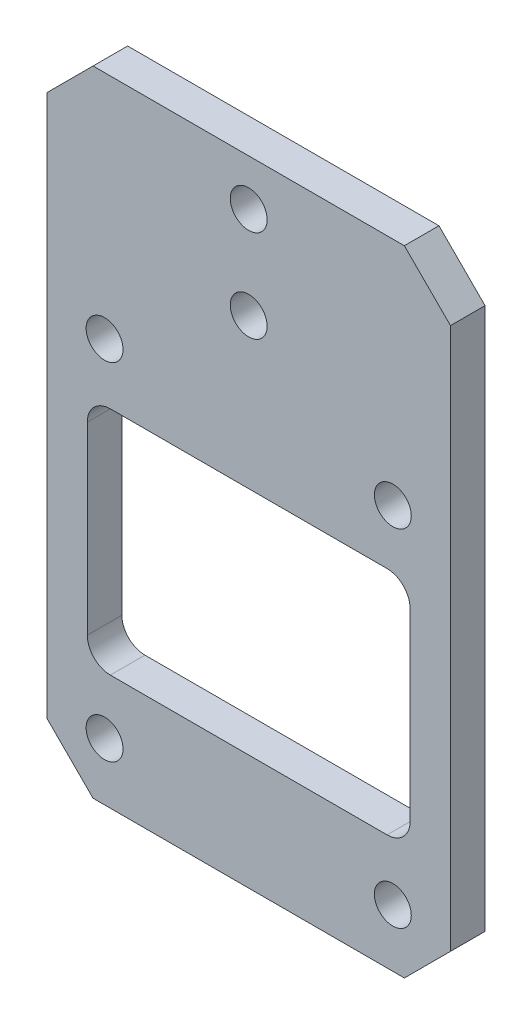
ISO-10303-21;
HEADER;
FILE_DESCRIPTION(('STEP AP214'),'2;1');
FILE_NAME('part.step','',(''),(''),'','','');
FILE_SCHEMA(('AUTOMOTIVE_DESIGN { 1 0 10303 214 1 1 1 1 }'));
ENDSEC;
DATA;
#1=APPLICATION_CONTEXT('core data for automotive mechanical design processes');
#2=APPLICATION_PROTOCOL_DEFINITION('international standard','automotive_design',2000,#1);
#3=PRODUCT_CONTEXT('',#1,'mechanical');
#4=PRODUCT('Part','Part','',(#3));
#5=PRODUCT_RELATED_PRODUCT_CATEGORY('part','',(#4));
#6=PRODUCT_DEFINITION_FORMATION('','',#4);
#7=PRODUCT_DEFINITION_CONTEXT('part definition',#1,'design');
#8=PRODUCT_DEFINITION('design','',#6,#7);
#9=PRODUCT_DEFINITION_SHAPE('','',#8);
#10=(LENGTH_UNIT() NAMED_UNIT(*) SI_UNIT(.MILLI.,.METRE.));
#11=(NAMED_UNIT(*) PLANE_ANGLE_UNIT() SI_UNIT($,.RADIAN.));
#12=(NAMED_UNIT(*) SI_UNIT($,.STERADIAN.) SOLID_ANGLE_UNIT());
#13=UNCERTAINTY_MEASURE_WITH_UNIT(LENGTH_MEASURE(1.E-05),#10,'distance_accuracy_value','');
#14=(GEOMETRIC_REPRESENTATION_CONTEXT(3) GLOBAL_UNCERTAINTY_ASSIGNED_CONTEXT((#13)) GLOBAL_UNIT_ASSIGNED_CONTEXT((#10,
#11,#12)) REPRESENTATION_CONTEXT('',''));
#15=CARTESIAN_POINT('',(0.,0.,0.));
#16=DIRECTION('',(0.,0.,1.));
#17=DIRECTION('',(1.,0.,0.));
#18=AXIS2_PLACEMENT_3D('',#15,#16,#17);
#19=CARTESIAN_POINT('',(-17.5,-27.5,3.));
#20=DIRECTION('',(1.,0.,0.));
#21=DIRECTION('',(0.,0.,-1.));
#22=AXIS2_PLACEMENT_3D('',#19,#20,#21);
#23=PLANE('',#22);
#24=DIRECTION('',(0.,-1.,0.));
#25=VECTOR('',#24,1.);
#26=CARTESIAN_POINT('',(-17.5,-27.5,0.));
#27=LINE('',#26,#25);
#28=CARTESIAN_POINT('',(-17.5,23.5,0.));
#29=VERTEX_POINT('',#28);
#30=CARTESIAN_POINT('',(-17.5,-23.5,0.));
#31=VERTEX_POINT('',#30);
#32=EDGE_CURVE('E179',#29,#31,#27,.T.);
#33=ORIENTED_EDGE('',*,*,#32,.T.);
#34=DIRECTION('',(0.,0.,1.));
#35=VECTOR('',#34,1.);
#36=CARTESIAN_POINT('',(-17.5,-23.5,3.));
#37=LINE('',#36,#35);
#38=CARTESIAN_POINT('',(-17.5,-23.5,3.));
#39=VERTEX_POINT('',#38);
#40=EDGE_CURVE('E157',#31,#39,#37,.T.);
#41=ORIENTED_EDGE('',*,*,#40,.T.);
#42=DIRECTION('',(0.,-1.,0.));
#43=VECTOR('',#42,1.);
#44=CARTESIAN_POINT('',(-17.5,-27.5,3.));
#45=LINE('',#44,#43);
#46=CARTESIAN_POINT('',(-17.5,23.5,3.));
#47=VERTEX_POINT('',#46);
#48=EDGE_CURVE('E190',#47,#39,#45,.T.);
#49=ORIENTED_EDGE('',*,*,#48,.F.);
#50=DIRECTION('',(0.,0.,-1.));
#51=VECTOR('',#50,1.);
#52=CARTESIAN_POINT('',(-17.5,23.5,3.));
#53=LINE('',#52,#51);
#54=EDGE_CURVE('E162',#47,#29,#53,.T.);
#55=ORIENTED_EDGE('',*,*,#54,.T.);
#56=EDGE_LOOP('',(#33,#41,#49,#55));
#57=FACE_BOUND('',#56,.T.);
#58=ADVANCED_FACE('F39',(#57),#23,.F.);
#59=CARTESIAN_POINT('',(17.5,-27.5,3.));
#60=DIRECTION('',(0.,1.,0.));
#61=DIRECTION('',(-1.,0.,0.));
#62=AXIS2_PLACEMENT_3D('',#59,#60,#61);
#63=PLANE('',#62);
#64=DIRECTION('',(1.,0.,0.));
#65=VECTOR('',#64,1.);
#66=CARTESIAN_POINT('',(17.5,-27.5,3.));
#67=LINE('',#66,#65);
#68=CARTESIAN_POINT('',(-13.5,-27.5,3.));
#69=VERTEX_POINT('',#68);
#70=CARTESIAN_POINT('',(13.5,-27.5,3.));
#71=VERTEX_POINT('',#70);
#72=EDGE_CURVE('E172',#69,#71,#67,.T.);
#73=ORIENTED_EDGE('',*,*,#72,.F.);
#74=DIRECTION('',(0.,0.,-1.));
#75=VECTOR('',#74,1.);
#76=CARTESIAN_POINT('',(-13.5,-27.5,3.));
#77=LINE('',#76,#75);
#78=CARTESIAN_POINT('',(-13.5,-27.5,0.));
#79=VERTEX_POINT('',#78);
#80=EDGE_CURVE('E156',#69,#79,#77,.T.);
#81=ORIENTED_EDGE('',*,*,#80,.T.);
#82=DIRECTION('',(1.,0.,0.));
#83=VECTOR('',#82,1.);
#84=CARTESIAN_POINT('',(17.5,-27.5,0.));
#85=LINE('',#84,#83);
#86=CARTESIAN_POINT('',(13.5,-27.5,0.));
#87=VERTEX_POINT('',#86);
#88=EDGE_CURVE('E169',#79,#87,#85,.T.);
#89=ORIENTED_EDGE('',*,*,#88,.T.);
#90=DIRECTION('',(0.,0.,1.));
#91=VECTOR('',#90,1.);
#92=CARTESIAN_POINT('',(13.5,-27.5,3.));
#93=LINE('',#92,#91);
#94=EDGE_CURVE('E174',#87,#71,#93,.T.);
#95=ORIENTED_EDGE('',*,*,#94,.T.);
#96=EDGE_LOOP('',(#73,#81,#89,#95));
#97=FACE_BOUND('',#96,.T.);
#98=ADVANCED_FACE('F168',(#97),#63,.F.);
#99=CARTESIAN_POINT('',(17.5,-27.5,3.));
#100=DIRECTION('',(-1.,0.,0.));
#101=DIRECTION('',(0.,0.,1.));
#102=AXIS2_PLACEMENT_3D('',#99,#100,#101);
#103=PLANE('',#102);
#104=DIRECTION('',(0.,1.,0.));
#105=VECTOR('',#104,1.);
#106=CARTESIAN_POINT('',(17.5,-27.5,3.));
#107=LINE('',#106,#105);
#108=CARTESIAN_POINT('',(17.5,-23.5,3.));
#109=VERTEX_POINT('',#108);
#110=CARTESIAN_POINT('',(17.5,23.5,3.));
#111=VERTEX_POINT('',#110);
#112=EDGE_CURVE('E322',#109,#111,#107,.T.);
#113=ORIENTED_EDGE('',*,*,#112,.F.);
#114=DIRECTION('',(0.,0.,-1.));
#115=VECTOR('',#114,1.);
#116=CARTESIAN_POINT('',(17.5,-23.5,3.));
#117=LINE('',#116,#115);
#118=CARTESIAN_POINT('',(17.5,-23.5,0.));
#119=VERTEX_POINT('',#118);
#120=EDGE_CURVE('E210',#109,#119,#117,.T.);
#121=ORIENTED_EDGE('',*,*,#120,.T.);
#122=DIRECTION('',(0.,1.,0.));
#123=VECTOR('',#122,1.);
#124=CARTESIAN_POINT('',(17.5,-27.5,0.));
#125=LINE('',#124,#123);
#126=CARTESIAN_POINT('',(17.5,23.5,0.));
#127=VERTEX_POINT('',#126);
#128=EDGE_CURVE('E178',#119,#127,#125,.T.);
#129=ORIENTED_EDGE('',*,*,#128,.T.);
#130=DIRECTION('',(0.,0.,1.));
#131=VECTOR('',#130,1.);
#132=CARTESIAN_POINT('',(17.5,23.5,3.));
#133=LINE('',#132,#131);
#134=EDGE_CURVE('E208',#127,#111,#133,.T.);
#135=ORIENTED_EDGE('',*,*,#134,.T.);
#136=EDGE_LOOP('',(#113,#121,#129,#135));
#137=FACE_BOUND('',#136,.T.);
#138=ADVANCED_FACE('F344',(#137),#103,.F.);
#139=CARTESIAN_POINT('',(17.5,27.5,3.));
#140=DIRECTION('',(0.,-1.,0.));
#141=DIRECTION('',(1.,0.,0.));
#142=AXIS2_PLACEMENT_3D('',#139,#140,#141);
#143=PLANE('',#142);
#144=DIRECTION('',(-1.,0.,0.));
#145=VECTOR('',#144,1.);
#146=CARTESIAN_POINT('',(17.5,27.5,3.));
#147=LINE('',#146,#145);
#148=CARTESIAN_POINT('',(13.5,27.5,3.));
#149=VERTEX_POINT('',#148);
#150=CARTESIAN_POINT('',(-13.5,27.5,3.));
#151=VERTEX_POINT('',#150);
#152=EDGE_CURVE('E191',#149,#151,#147,.T.);
#153=ORIENTED_EDGE('',*,*,#152,.F.);
#154=DIRECTION('',(0.,0.,-1.));
#155=VECTOR('',#154,1.);
#156=CARTESIAN_POINT('',(13.5,27.5,3.));
#157=LINE('',#156,#155);
#158=CARTESIAN_POINT('',(13.5,27.5,0.));
#159=VERTEX_POINT('',#158);
#160=EDGE_CURVE('E215',#149,#159,#157,.T.);
#161=ORIENTED_EDGE('',*,*,#160,.T.);
#162=DIRECTION('',(-1.,0.,0.));
#163=VECTOR('',#162,1.);
#164=CARTESIAN_POINT('',(17.5,27.5,0.));
#165=LINE('',#164,#163);
#166=CARTESIAN_POINT('',(-13.5,27.5,0.));
#167=VERTEX_POINT('',#166);
#168=EDGE_CURVE('E182',#159,#167,#165,.T.);
#169=ORIENTED_EDGE('',*,*,#168,.T.);
#170=DIRECTION('',(0.,0.,1.));
#171=VECTOR('',#170,1.);
#172=CARTESIAN_POINT('',(-13.5,27.5,3.));
#173=LINE('',#172,#171);
#174=EDGE_CURVE('E213',#167,#151,#173,.T.);
#175=ORIENTED_EDGE('',*,*,#174,.T.);
#176=EDGE_LOOP('',(#153,#161,#169,#175));
#177=FACE_BOUND('',#176,.T.);
#178=ADVANCED_FACE('F338',(#177),#143,.F.);
#179=CARTESIAN_POINT('',(0.,0.,3.));
#180=DIRECTION('',(0.,0.,1.));
#181=DIRECTION('',(1.,0.,0.));
#182=AXIS2_PLACEMENT_3D('',#179,#180,#181);
#183=PLANE('',#182);
#184=DIRECTION('',(0.,-1.,0.));
#185=VECTOR('',#184,1.);
#186=CARTESIAN_POINT('',(-14.,-17.5,3.));
#187=LINE('',#186,#185);
#188=CARTESIAN_POINT('',(-14.,0.499999999999997,3.));
#189=VERTEX_POINT('',#188);
#190=CARTESIAN_POINT('',(-14.,-15.5,3.));
#191=VERTEX_POINT('',#190);
#192=EDGE_CURVE('E255',#189,#191,#187,.T.);
#193=ORIENTED_EDGE('',*,*,#192,.F.);
#194=CARTESIAN_POINT('',(-12.,0.499999999999997,3.));
#195=DIRECTION('',(0.,0.,1.));
#196=DIRECTION('',(1.,0.,0.));
#197=AXIS2_PLACEMENT_3D('',#194,#195,#196);
#198=CIRCLE('',#197,2.);
#199=CARTESIAN_POINT('',(-12.,2.5,3.));
#200=VERTEX_POINT('',#199);
#201=EDGE_CURVE('E47',#189,#200,#198,.F.);
#202=ORIENTED_EDGE('',*,*,#201,.T.);
#203=DIRECTION('',(-1.,0.,0.));
#204=VECTOR('',#203,1.);
#205=CARTESIAN_POINT('',(14.,2.5,3.));
#206=LINE('',#205,#204);
#207=CARTESIAN_POINT('',(12.,2.5,3.));
#208=VERTEX_POINT('',#207);
#209=EDGE_CURVE('E254',#208,#200,#206,.T.);
#210=ORIENTED_EDGE('',*,*,#209,.F.);
#211=CARTESIAN_POINT('',(12.,0.5,3.));
#212=DIRECTION('',(0.,0.,1.));
#213=DIRECTION('',(1.,0.,0.));
#214=AXIS2_PLACEMENT_3D('',#211,#212,#213);
#215=CIRCLE('',#214,2.);
#216=CARTESIAN_POINT('',(14.,0.5,3.));
#217=VERTEX_POINT('',#216);
#218=EDGE_CURVE('E237',#208,#217,#215,.F.);
#219=ORIENTED_EDGE('',*,*,#218,.T.);
#220=DIRECTION('',(0.,1.,0.));
#221=VECTOR('',#220,1.);
#222=CARTESIAN_POINT('',(14.,-17.5,3.));
#223=LINE('',#222,#221);
#224=CARTESIAN_POINT('',(14.,-15.5,3.));
#225=VERTEX_POINT('',#224);
#226=EDGE_CURVE('E264',#225,#217,#223,.T.);
#227=ORIENTED_EDGE('',*,*,#226,.F.);
#228=CARTESIAN_POINT('',(12.,-15.5,3.));
#229=DIRECTION('',(0.,0.,1.));
#230=DIRECTION('',(1.,0.,0.));
#231=AXIS2_PLACEMENT_3D('',#228,#229,#230);
#232=CIRCLE('',#231,2.);
#233=CARTESIAN_POINT('',(12.,-17.5,3.));
#234=VERTEX_POINT('',#233);
#235=EDGE_CURVE('E241',#225,#234,#232,.F.);
#236=ORIENTED_EDGE('',*,*,#235,.T.);
#237=DIRECTION('',(1.,0.,0.));
#238=VECTOR('',#237,1.);
#239=CARTESIAN_POINT('',(14.,-17.5,3.));
#240=LINE('',#239,#238);
#241=CARTESIAN_POINT('',(-12.,-17.5,3.));
#242=VERTEX_POINT('',#241);
#243=EDGE_CURVE('E280',#242,#234,#240,.T.);
#244=ORIENTED_EDGE('',*,*,#243,.F.);
#245=CARTESIAN_POINT('',(-12.,-15.5,3.));
#246=DIRECTION('',(0.,0.,1.));
#247=DIRECTION('',(1.,0.,0.));
#248=AXIS2_PLACEMENT_3D('',#245,#246,#247);
#249=CIRCLE('',#248,2.);
#250=EDGE_CURVE('E245',#242,#191,#249,.F.);
#251=ORIENTED_EDGE('',*,*,#250,.T.);
#252=EDGE_LOOP('',(#193,#202,#210,#219,#227,#236,#244,#251));
#253=FACE_BOUND('',#252,.T.);
#254=CARTESIAN_POINT('',(0.,15.5,3.));
#255=DIRECTION('',(0.,0.,1.));
#256=DIRECTION('',(1.,0.,0.));
#257=AXIS2_PLACEMENT_3D('',#254,#255,#256);
#258=CIRCLE('',#257,1.6);
#259=CARTESIAN_POINT('',(1.6,15.5,3.));
#260=VERTEX_POINT('',#259);
#261=EDGE_CURVE('E278',#260,#260,#258,.T.);
#262=ORIENTED_EDGE('',*,*,#261,.F.);
#263=EDGE_LOOP('',(#262));
#264=FACE_BOUND('',#263,.T.);
#265=CARTESIAN_POINT('',(0.,23.5,3.));
#266=DIRECTION('',(0.,0.,1.));
#267=DIRECTION('',(1.,0.,0.));
#268=AXIS2_PLACEMENT_3D('',#265,#266,#267);
#269=CIRCLE('',#268,1.6);
#270=CARTESIAN_POINT('',(1.6,23.5,3.));
#271=VERTEX_POINT('',#270);
#272=EDGE_CURVE('E288',#271,#271,#269,.T.);
#273=ORIENTED_EDGE('',*,*,#272,.F.);
#274=EDGE_LOOP('',(#273));
#275=FACE_BOUND('',#274,.T.);
#276=CARTESIAN_POINT('',(-12.5,-22.5,3.));
#277=DIRECTION('',(0.,0.,1.));
#278=DIRECTION('',(1.,0.,0.));
#279=AXIS2_PLACEMENT_3D('',#276,#277,#278);
#280=CIRCLE('',#279,1.6);
#281=CARTESIAN_POINT('',(-10.9,-22.5,3.));
#282=VERTEX_POINT('',#281);
#283=EDGE_CURVE('E301',#282,#282,#280,.T.);
#284=ORIENTED_EDGE('',*,*,#283,.F.);
#285=EDGE_LOOP('',(#284));
#286=FACE_BOUND('',#285,.T.);
#287=CARTESIAN_POINT('',(12.5,7.5,3.));
#288=DIRECTION('',(0.,0.,1.));
#289=DIRECTION('',(1.,0.,0.));
#290=AXIS2_PLACEMENT_3D('',#287,#288,#289);
#291=CIRCLE('',#290,1.6);
#292=CARTESIAN_POINT('',(14.1,7.5,3.));
#293=VERTEX_POINT('',#292);
#294=EDGE_CURVE('E307',#293,#293,#291,.T.);
#295=ORIENTED_EDGE('',*,*,#294,.F.);
#296=EDGE_LOOP('',(#295));
#297=FACE_BOUND('',#296,.T.);
#298=CARTESIAN_POINT('',(12.5,-22.5,3.));
#299=DIRECTION('',(0.,0.,1.));
#300=DIRECTION('',(1.,0.,0.));
#301=AXIS2_PLACEMENT_3D('',#298,#299,#300);
#302=CIRCLE('',#301,1.6);
#303=CARTESIAN_POINT('',(14.1,-22.5,3.));
#304=VERTEX_POINT('',#303);
#305=EDGE_CURVE('E294',#304,#304,#302,.T.);
#306=ORIENTED_EDGE('',*,*,#305,.F.);
#307=EDGE_LOOP('',(#306));
#308=FACE_BOUND('',#307,.T.);
#309=CARTESIAN_POINT('',(-12.5,7.5,3.));
#310=DIRECTION('',(0.,0.,1.));
#311=DIRECTION('',(1.,0.,0.));
#312=AXIS2_PLACEMENT_3D('',#309,#310,#311);
#313=CIRCLE('',#312,1.6);
#314=CARTESIAN_POINT('',(-10.9,7.5,3.));
#315=VERTEX_POINT('',#314);
#316=EDGE_CURVE('E300',#315,#315,#313,.T.);
#317=ORIENTED_EDGE('',*,*,#316,.F.);
#318=EDGE_LOOP('',(#317));
#319=FACE_BOUND('',#318,.T.);
#320=ORIENTED_EDGE('',*,*,#48,.T.);
#321=DIRECTION('',(-0.707106781186546,0.707106781186549,0.));
#322=VECTOR('',#321,1.);
#323=CARTESIAN_POINT('',(-20.5,-20.5,3.));
#324=LINE('',#323,#322);
#325=EDGE_CURVE('E206',#39,#69,#324,.F.);
#326=ORIENTED_EDGE('',*,*,#325,.T.);
#327=ORIENTED_EDGE('',*,*,#72,.T.);
#328=DIRECTION('',(-0.707106781186549,-0.707106781186546,0.));
#329=VECTOR('',#328,1.);
#330=CARTESIAN_POINT('',(20.5,-20.5,3.));
#331=LINE('',#330,#329);
#332=EDGE_CURVE('E204',#71,#109,#331,.F.);
#333=ORIENTED_EDGE('',*,*,#332,.T.);
#334=ORIENTED_EDGE('',*,*,#112,.T.);
#335=DIRECTION('',(0.707106781186546,-0.707106781186549,0.));
#336=VECTOR('',#335,1.);
#337=CARTESIAN_POINT('',(20.5,20.5,3.));
#338=LINE('',#337,#336);
#339=EDGE_CURVE('E202',#111,#149,#338,.F.);
#340=ORIENTED_EDGE('',*,*,#339,.T.);
#341=ORIENTED_EDGE('',*,*,#152,.T.);
#342=DIRECTION('',(0.707106781186549,0.707106781186546,0.));
#343=VECTOR('',#342,1.);
#344=CARTESIAN_POINT('',(-20.5,20.5,3.));
#345=LINE('',#344,#343);
#346=EDGE_CURVE('E200',#151,#47,#345,.F.);
#347=ORIENTED_EDGE('',*,*,#346,.T.);
#348=EDGE_LOOP('',(#320,#326,#327,#333,#334,#340,#341,#347));
#349=FACE_BOUND('',#348,.T.);
#350=ADVANCED_FACE('F252',(#253,#264,#275,#286,#297,#308,#319,#349),#183,.T.);
#351=CARTESIAN_POINT('',(0.,0.,0.));
#352=DIRECTION('',(0.,0.,1.));
#353=DIRECTION('',(1.,0.,0.));
#354=AXIS2_PLACEMENT_3D('',#351,#352,#353);
#355=PLANE('',#354);
#356=DIRECTION('',(0.,1.,0.));
#357=VECTOR('',#356,1.);
#358=CARTESIAN_POINT('',(14.,-17.5,0.));
#359=LINE('',#358,#357);
#360=CARTESIAN_POINT('',(14.,-15.5,0.));
#361=VERTEX_POINT('',#360);
#362=CARTESIAN_POINT('',(14.,0.5,0.));
#363=VERTEX_POINT('',#362);
#364=EDGE_CURVE('E271',#361,#363,#359,.T.);
#365=ORIENTED_EDGE('',*,*,#364,.T.);
#366=CARTESIAN_POINT('',(12.,0.5,0.));
#367=DIRECTION('',(0.,0.,1.));
#368=DIRECTION('',(1.,0.,0.));
#369=AXIS2_PLACEMENT_3D('',#366,#367,#368);
#370=CIRCLE('',#369,2.);
#371=CARTESIAN_POINT('',(12.,2.5,0.));
#372=VERTEX_POINT('',#371);
#373=EDGE_CURVE('E239',#363,#372,#370,.T.);
#374=ORIENTED_EDGE('',*,*,#373,.T.);
#375=DIRECTION('',(-1.,0.,0.));
#376=VECTOR('',#375,1.);
#377=CARTESIAN_POINT('',(14.,2.5,0.));
#378=LINE('',#377,#376);
#379=CARTESIAN_POINT('',(-12.,2.5,0.));
#380=VERTEX_POINT('',#379);
#381=EDGE_CURVE('E276',#372,#380,#378,.T.);
#382=ORIENTED_EDGE('',*,*,#381,.T.);
#383=CARTESIAN_POINT('',(-12.,0.499999999999997,0.));
#384=DIRECTION('',(0.,0.,1.));
#385=DIRECTION('',(1.,0.,0.));
#386=AXIS2_PLACEMENT_3D('',#383,#384,#385);
#387=CIRCLE('',#386,2.);
#388=CARTESIAN_POINT('',(-14.,0.499999999999997,0.));
#389=VERTEX_POINT('',#388);
#390=EDGE_CURVE('E11',#380,#389,#387,.T.);
#391=ORIENTED_EDGE('',*,*,#390,.T.);
#392=DIRECTION('',(0.,-1.,0.));
#393=VECTOR('',#392,1.);
#394=CARTESIAN_POINT('',(-14.,-17.5,0.));
#395=LINE('',#394,#393);
#396=CARTESIAN_POINT('',(-14.,-15.5,0.));
#397=VERTEX_POINT('',#396);
#398=EDGE_CURVE('E263',#389,#397,#395,.T.);
#399=ORIENTED_EDGE('',*,*,#398,.T.);
#400=CARTESIAN_POINT('',(-12.,-15.5,0.));
#401=DIRECTION('',(0.,0.,1.));
#402=DIRECTION('',(1.,0.,0.));
#403=AXIS2_PLACEMENT_3D('',#400,#401,#402);
#404=CIRCLE('',#403,2.);
#405=CARTESIAN_POINT('',(-12.,-17.5,0.));
#406=VERTEX_POINT('',#405);
#407=EDGE_CURVE('E247',#397,#406,#404,.T.);
#408=ORIENTED_EDGE('',*,*,#407,.T.);
#409=DIRECTION('',(1.,0.,0.));
#410=VECTOR('',#409,1.);
#411=CARTESIAN_POINT('',(14.,-17.5,0.));
#412=LINE('',#411,#410);
#413=CARTESIAN_POINT('',(12.,-17.5,0.));
#414=VERTEX_POINT('',#413);
#415=EDGE_CURVE('E268',#406,#414,#412,.T.);
#416=ORIENTED_EDGE('',*,*,#415,.T.);
#417=CARTESIAN_POINT('',(12.,-15.5,0.));
#418=DIRECTION('',(0.,0.,1.));
#419=DIRECTION('',(1.,0.,0.));
#420=AXIS2_PLACEMENT_3D('',#417,#418,#419);
#421=CIRCLE('',#420,2.);
#422=EDGE_CURVE('E243',#414,#361,#421,.T.);
#423=ORIENTED_EDGE('',*,*,#422,.T.);
#424=EDGE_LOOP('',(#365,#374,#382,#391,#399,#408,#416,#423));
#425=FACE_BOUND('',#424,.T.);
#426=CARTESIAN_POINT('',(0.,15.5,0.));
#427=DIRECTION('',(0.,0.,1.));
#428=DIRECTION('',(1.,0.,0.));
#429=AXIS2_PLACEMENT_3D('',#426,#427,#428);
#430=CIRCLE('',#429,1.6);
#431=CARTESIAN_POINT('',(1.6,15.5,0.));
#432=VERTEX_POINT('',#431);
#433=EDGE_CURVE('E285',#432,#432,#430,.T.);
#434=ORIENTED_EDGE('',*,*,#433,.T.);
#435=EDGE_LOOP('',(#434));
#436=FACE_BOUND('',#435,.T.);
#437=CARTESIAN_POINT('',(0.,23.5,0.));
#438=DIRECTION('',(0.,0.,1.));
#439=DIRECTION('',(1.,0.,0.));
#440=AXIS2_PLACEMENT_3D('',#437,#438,#439);
#441=CIRCLE('',#440,1.6);
#442=CARTESIAN_POINT('',(1.6,23.5,0.));
#443=VERTEX_POINT('',#442);
#444=EDGE_CURVE('E291',#443,#443,#441,.T.);
#445=ORIENTED_EDGE('',*,*,#444,.T.);
#446=EDGE_LOOP('',(#445));
#447=FACE_BOUND('',#446,.T.);
#448=CARTESIAN_POINT('',(-12.5,-22.5,0.));
#449=DIRECTION('',(0.,0.,1.));
#450=DIRECTION('',(1.,0.,0.));
#451=AXIS2_PLACEMENT_3D('',#448,#449,#450);
#452=CIRCLE('',#451,1.6);
#453=CARTESIAN_POINT('',(-10.9,-22.5,0.));
#454=VERTEX_POINT('',#453);
#455=EDGE_CURVE('E297',#454,#454,#452,.T.);
#456=ORIENTED_EDGE('',*,*,#455,.T.);
#457=EDGE_LOOP('',(#456));
#458=FACE_BOUND('',#457,.T.);
#459=CARTESIAN_POINT('',(12.5,7.5,0.));
#460=DIRECTION('',(0.,0.,1.));
#461=DIRECTION('',(1.,0.,0.));
#462=AXIS2_PLACEMENT_3D('',#459,#460,#461);
#463=CIRCLE('',#462,1.6);
#464=CARTESIAN_POINT('',(14.1,7.5,0.));
#465=VERTEX_POINT('',#464);
#466=EDGE_CURVE('E304',#465,#465,#463,.T.);
#467=ORIENTED_EDGE('',*,*,#466,.T.);
#468=EDGE_LOOP('',(#467));
#469=FACE_BOUND('',#468,.T.);
#470=CARTESIAN_POINT('',(12.5,-22.5,0.));
#471=DIRECTION('',(0.,0.,1.));
#472=DIRECTION('',(1.,0.,0.));
#473=AXIS2_PLACEMENT_3D('',#470,#471,#472);
#474=CIRCLE('',#473,1.6);
#475=CARTESIAN_POINT('',(14.1,-22.5,0.));
#476=VERTEX_POINT('',#475);
#477=EDGE_CURVE('E310',#476,#476,#474,.T.);
#478=ORIENTED_EDGE('',*,*,#477,.T.);
#479=EDGE_LOOP('',(#478));
#480=FACE_BOUND('',#479,.T.);
#481=CARTESIAN_POINT('',(-12.5,7.5,0.));
#482=DIRECTION('',(0.,0.,1.));
#483=DIRECTION('',(1.,0.,0.));
#484=AXIS2_PLACEMENT_3D('',#481,#482,#483);
#485=CIRCLE('',#484,1.6);
#486=CARTESIAN_POINT('',(-10.9,7.5,0.));
#487=VERTEX_POINT('',#486);
#488=EDGE_CURVE('E184',#487,#487,#485,.T.);
#489=ORIENTED_EDGE('',*,*,#488,.T.);
#490=EDGE_LOOP('',(#489));
#491=FACE_BOUND('',#490,.T.);
#492=ORIENTED_EDGE('',*,*,#88,.F.);
#493=DIRECTION('',(0.707106781186546,-0.707106781186549,0.));
#494=VECTOR('',#493,1.);
#495=CARTESIAN_POINT('',(-13.5,-27.5,0.));
#496=LINE('',#495,#494);
#497=EDGE_CURVE('E152',#79,#31,#496,.F.);
#498=ORIENTED_EDGE('',*,*,#497,.T.);
#499=ORIENTED_EDGE('',*,*,#32,.F.);
#500=DIRECTION('',(-0.707106781186549,-0.707106781186546,0.));
#501=VECTOR('',#500,1.);
#502=CARTESIAN_POINT('',(-17.5,23.5,0.));
#503=LINE('',#502,#501);
#504=EDGE_CURVE('E173',#29,#167,#503,.F.);
#505=ORIENTED_EDGE('',*,*,#504,.T.);
#506=ORIENTED_EDGE('',*,*,#168,.F.);
#507=DIRECTION('',(-0.707106781186546,0.707106781186549,0.));
#508=VECTOR('',#507,1.);
#509=CARTESIAN_POINT('',(13.5,27.5,0.));
#510=LINE('',#509,#508);
#511=EDGE_CURVE('E194',#159,#127,#510,.F.);
#512=ORIENTED_EDGE('',*,*,#511,.T.);
#513=ORIENTED_EDGE('',*,*,#128,.F.);
#514=DIRECTION('',(0.707106781186549,0.707106781186546,0.));
#515=VECTOR('',#514,1.);
#516=CARTESIAN_POINT('',(17.5,-23.5,0.));
#517=LINE('',#516,#515);
#518=EDGE_CURVE('E163',#119,#87,#517,.F.);
#519=ORIENTED_EDGE('',*,*,#518,.T.);
#520=EDGE_LOOP('',(#492,#498,#499,#505,#506,#512,#513,#519));
#521=FACE_BOUND('',#520,.T.);
#522=ADVANCED_FACE('F176',(#425,#436,#447,#458,#469,#480,#491,#521),#355,.F.);
#523=CARTESIAN_POINT('',(-13.5,-27.5,3.));
#524=DIRECTION('',(0.707106781186549,0.707106781186546,0.));
#525=DIRECTION('',(0.,0.,-1.));
#526=AXIS2_PLACEMENT_3D('',#523,#524,#525);
#527=PLANE('',#526);
#528=ORIENTED_EDGE('',*,*,#325,.F.);
#529=ORIENTED_EDGE('',*,*,#40,.F.);
#530=ORIENTED_EDGE('',*,*,#497,.F.);
#531=ORIENTED_EDGE('',*,*,#80,.F.);
#532=EDGE_LOOP('',(#528,#529,#530,#531));
#533=FACE_BOUND('',#532,.T.);
#534=ADVANCED_FACE('F155',(#533),#527,.F.);
#535=CARTESIAN_POINT('',(17.5,-23.5,3.));
#536=DIRECTION('',(-0.707106781186546,0.707106781186549,0.));
#537=DIRECTION('',(0.,0.,-1.));
#538=AXIS2_PLACEMENT_3D('',#535,#536,#537);
#539=PLANE('',#538);
#540=ORIENTED_EDGE('',*,*,#332,.F.);
#541=ORIENTED_EDGE('',*,*,#94,.F.);
#542=ORIENTED_EDGE('',*,*,#518,.F.);
#543=ORIENTED_EDGE('',*,*,#120,.F.);
#544=EDGE_LOOP('',(#540,#541,#542,#543));
#545=FACE_BOUND('',#544,.T.);
#546=ADVANCED_FACE('F348',(#545),#539,.F.);
#547=CARTESIAN_POINT('',(13.5,27.5,3.));
#548=DIRECTION('',(-0.707106781186549,-0.707106781186546,0.));
#549=DIRECTION('',(0.,0.,-1.));
#550=AXIS2_PLACEMENT_3D('',#547,#548,#549);
#551=PLANE('',#550);
#552=ORIENTED_EDGE('',*,*,#339,.F.);
#553=ORIENTED_EDGE('',*,*,#134,.F.);
#554=ORIENTED_EDGE('',*,*,#511,.F.);
#555=ORIENTED_EDGE('',*,*,#160,.F.);
#556=EDGE_LOOP('',(#552,#553,#554,#555));
#557=FACE_BOUND('',#556,.T.);
#558=ADVANCED_FACE('F340',(#557),#551,.F.);
#559=CARTESIAN_POINT('',(-17.5,23.5,3.));
#560=DIRECTION('',(0.707106781186546,-0.707106781186549,0.));
#561=DIRECTION('',(0.,0.,-1.));
#562=AXIS2_PLACEMENT_3D('',#559,#560,#561);
#563=PLANE('',#562);
#564=ORIENTED_EDGE('',*,*,#346,.F.);
#565=ORIENTED_EDGE('',*,*,#174,.F.);
#566=ORIENTED_EDGE('',*,*,#504,.F.);
#567=ORIENTED_EDGE('',*,*,#54,.F.);
#568=EDGE_LOOP('',(#564,#565,#566,#567));
#569=FACE_BOUND('',#568,.T.);
#570=ADVANCED_FACE('F335',(#569),#563,.F.);
#571=CARTESIAN_POINT('',(-12.5,7.5,0.));
#572=DIRECTION('',(0.,0.,1.));
#573=DIRECTION('',(1.,0.,0.));
#574=AXIS2_PLACEMENT_3D('',#571,#572,#573);
#575=CYLINDRICAL_SURFACE('',#574,1.6);
#576=ORIENTED_EDGE('',*,*,#488,.F.);
#577=EDGE_LOOP('',(#576));
#578=FACE_BOUND('',#577,.T.);
#579=ORIENTED_EDGE('',*,*,#316,.T.);
#580=EDGE_LOOP('',(#579));
#581=FACE_BOUND('',#580,.T.);
#582=ADVANCED_FACE('F379',(#578,#581),#575,.F.);
#583=CARTESIAN_POINT('',(12.5,-22.5,0.));
#584=DIRECTION('',(0.,0.,1.));
#585=DIRECTION('',(1.,0.,0.));
#586=AXIS2_PLACEMENT_3D('',#583,#584,#585);
#587=CYLINDRICAL_SURFACE('',#586,1.6);
#588=ORIENTED_EDGE('',*,*,#477,.F.);
#589=EDGE_LOOP('',(#588));
#590=FACE_BOUND('',#589,.T.);
#591=ORIENTED_EDGE('',*,*,#305,.T.);
#592=EDGE_LOOP('',(#591));
#593=FACE_BOUND('',#592,.T.);
#594=ADVANCED_FACE('F434',(#590,#593),#587,.F.);
#595=CARTESIAN_POINT('',(12.5,7.5,0.));
#596=DIRECTION('',(0.,0.,1.));
#597=DIRECTION('',(1.,0.,0.));
#598=AXIS2_PLACEMENT_3D('',#595,#596,#597);
#599=CYLINDRICAL_SURFACE('',#598,1.6);
#600=ORIENTED_EDGE('',*,*,#466,.F.);
#601=EDGE_LOOP('',(#600));
#602=FACE_BOUND('',#601,.T.);
#603=ORIENTED_EDGE('',*,*,#294,.T.);
#604=EDGE_LOOP('',(#603));
#605=FACE_BOUND('',#604,.T.);
#606=ADVANCED_FACE('F430',(#602,#605),#599,.F.);
#607=CARTESIAN_POINT('',(-12.5,-22.5,0.));
#608=DIRECTION('',(0.,0.,1.));
#609=DIRECTION('',(1.,0.,0.));
#610=AXIS2_PLACEMENT_3D('',#607,#608,#609);
#611=CYLINDRICAL_SURFACE('',#610,1.6);
#612=ORIENTED_EDGE('',*,*,#455,.F.);
#613=EDGE_LOOP('',(#612));
#614=FACE_BOUND('',#613,.T.);
#615=ORIENTED_EDGE('',*,*,#283,.T.);
#616=EDGE_LOOP('',(#615));
#617=FACE_BOUND('',#616,.T.);
#618=ADVANCED_FACE('F426',(#614,#617),#611,.F.);
#619=CARTESIAN_POINT('',(0.,23.5,0.));
#620=DIRECTION('',(0.,0.,1.));
#621=DIRECTION('',(1.,0.,0.));
#622=AXIS2_PLACEMENT_3D('',#619,#620,#621);
#623=CYLINDRICAL_SURFACE('',#622,1.6);
#624=ORIENTED_EDGE('',*,*,#444,.F.);
#625=EDGE_LOOP('',(#624));
#626=FACE_BOUND('',#625,.T.);
#627=ORIENTED_EDGE('',*,*,#272,.T.);
#628=EDGE_LOOP('',(#627));
#629=FACE_BOUND('',#628,.T.);
#630=ADVANCED_FACE('F422',(#626,#629),#623,.F.);
#631=CARTESIAN_POINT('',(0.,15.5,0.));
#632=DIRECTION('',(0.,0.,1.));
#633=DIRECTION('',(1.,0.,0.));
#634=AXIS2_PLACEMENT_3D('',#631,#632,#633);
#635=CYLINDRICAL_SURFACE('',#634,1.6);
#636=ORIENTED_EDGE('',*,*,#433,.F.);
#637=EDGE_LOOP('',(#636));
#638=FACE_BOUND('',#637,.T.);
#639=ORIENTED_EDGE('',*,*,#261,.T.);
#640=EDGE_LOOP('',(#639));
#641=FACE_BOUND('',#640,.T.);
#642=ADVANCED_FACE('F419',(#638,#641),#635,.F.);
#643=CARTESIAN_POINT('',(-14.,-17.5,0.));
#644=DIRECTION('',(-1.,0.,0.));
#645=DIRECTION('',(0.,0.,1.));
#646=AXIS2_PLACEMENT_3D('',#643,#644,#645);
#647=PLANE('',#646);
#648=ORIENTED_EDGE('',*,*,#192,.T.);
#649=DIRECTION('',(0.,0.,1.));
#650=VECTOR('',#649,1.);
#651=CARTESIAN_POINT('',(-14.,-15.5,0.));
#652=LINE('',#651,#650);
#653=EDGE_CURVE('E54',#191,#397,#652,.F.);
#654=ORIENTED_EDGE('',*,*,#653,.T.);
#655=ORIENTED_EDGE('',*,*,#398,.F.);
#656=DIRECTION('',(0.,0.,1.));
#657=VECTOR('',#656,1.);
#658=CARTESIAN_POINT('',(-14.,0.499999999999997,3.));
#659=LINE('',#658,#657);
#660=EDGE_CURVE('E233',#389,#189,#659,.T.);
#661=ORIENTED_EDGE('',*,*,#660,.T.);
#662=EDGE_LOOP('',(#648,#654,#655,#661));
#663=FACE_BOUND('',#662,.T.);
#664=ADVANCED_FACE('F266',(#663),#647,.F.);
#665=CARTESIAN_POINT('',(14.,2.5,0.));
#666=DIRECTION('',(0.,1.,0.));
#667=DIRECTION('',(-1.,0.,0.));
#668=AXIS2_PLACEMENT_3D('',#665,#666,#667);
#669=PLANE('',#668);
#670=ORIENTED_EDGE('',*,*,#381,.F.);
#671=DIRECTION('',(0.,0.,1.));
#672=VECTOR('',#671,1.);
#673=CARTESIAN_POINT('',(12.,2.5,3.));
#674=LINE('',#673,#672);
#675=EDGE_CURVE('E220',#372,#208,#674,.T.);
#676=ORIENTED_EDGE('',*,*,#675,.T.);
#677=ORIENTED_EDGE('',*,*,#209,.T.);
#678=DIRECTION('',(0.,0.,1.));
#679=VECTOR('',#678,1.);
#680=CARTESIAN_POINT('',(-12.,2.5,0.));
#681=LINE('',#680,#679);
#682=EDGE_CURVE('E218',#200,#380,#681,.F.);
#683=ORIENTED_EDGE('',*,*,#682,.T.);
#684=EDGE_LOOP('',(#670,#676,#677,#683));
#685=FACE_BOUND('',#684,.T.);
#686=ADVANCED_FACE('F261',(#685),#669,.F.);
#687=CARTESIAN_POINT('',(14.,-17.5,0.));
#688=DIRECTION('',(1.,0.,0.));
#689=DIRECTION('',(0.,0.,-1.));
#690=AXIS2_PLACEMENT_3D('',#687,#688,#689);
#691=PLANE('',#690);
#692=ORIENTED_EDGE('',*,*,#226,.T.);
#693=DIRECTION('',(0.,0.,1.));
#694=VECTOR('',#693,1.);
#695=CARTESIAN_POINT('',(14.,0.5,0.));
#696=LINE('',#695,#694);
#697=EDGE_CURVE('E226',#217,#363,#696,.F.);
#698=ORIENTED_EDGE('',*,*,#697,.T.);
#699=ORIENTED_EDGE('',*,*,#364,.F.);
#700=DIRECTION('',(0.,0.,1.));
#701=VECTOR('',#700,1.);
#702=CARTESIAN_POINT('',(14.,-15.5,3.));
#703=LINE('',#702,#701);
#704=EDGE_CURVE('E223',#361,#225,#703,.T.);
#705=ORIENTED_EDGE('',*,*,#704,.T.);
#706=EDGE_LOOP('',(#692,#698,#699,#705));
#707=FACE_BOUND('',#706,.T.);
#708=ADVANCED_FACE('F405',(#707),#691,.F.);
#709=CARTESIAN_POINT('',(14.,-17.5,0.));
#710=DIRECTION('',(0.,-1.,0.));
#711=DIRECTION('',(0.,0.,-1.));
#712=AXIS2_PLACEMENT_3D('',#709,#710,#711);
#713=PLANE('',#712);
#714=ORIENTED_EDGE('',*,*,#243,.T.);
#715=DIRECTION('',(0.,0.,1.));
#716=VECTOR('',#715,1.);
#717=CARTESIAN_POINT('',(12.,-17.5,0.));
#718=LINE('',#717,#716);
#719=EDGE_CURVE('E231',#234,#414,#718,.F.);
#720=ORIENTED_EDGE('',*,*,#719,.T.);
#721=ORIENTED_EDGE('',*,*,#415,.F.);
#722=DIRECTION('',(0.,0.,1.));
#723=VECTOR('',#722,1.);
#724=CARTESIAN_POINT('',(-12.,-17.5,3.));
#725=LINE('',#724,#723);
#726=EDGE_CURVE('E228',#406,#242,#725,.T.);
#727=ORIENTED_EDGE('',*,*,#726,.T.);
#728=EDGE_LOOP('',(#714,#720,#721,#727));
#729=FACE_BOUND('',#728,.T.);
#730=ADVANCED_FACE('F384',(#729),#713,.F.);
#731=CARTESIAN_POINT('',(12.,0.5,0.));
#732=DIRECTION('',(0.,0.,-1.));
#733=DIRECTION('',(-1.,0.,0.));
#734=AXIS2_PLACEMENT_3D('',#731,#732,#733);
#735=CYLINDRICAL_SURFACE('',#734,2.);
#736=ORIENTED_EDGE('',*,*,#373,.F.);
#737=ORIENTED_EDGE('',*,*,#697,.F.);
#738=ORIENTED_EDGE('',*,*,#218,.F.);
#739=ORIENTED_EDGE('',*,*,#675,.F.);
#740=EDGE_LOOP('',(#736,#737,#738,#739));
#741=FACE_BOUND('',#740,.T.);
#742=ADVANCED_FACE('F380',(#741),#735,.F.);
#743=CARTESIAN_POINT('',(12.,-15.5,0.));
#744=DIRECTION('',(0.,0.,-1.));
#745=DIRECTION('',(-1.,0.,0.));
#746=AXIS2_PLACEMENT_3D('',#743,#744,#745);
#747=CYLINDRICAL_SURFACE('',#746,2.);
#748=ORIENTED_EDGE('',*,*,#422,.F.);
#749=ORIENTED_EDGE('',*,*,#719,.F.);
#750=ORIENTED_EDGE('',*,*,#235,.F.);
#751=ORIENTED_EDGE('',*,*,#704,.F.);
#752=EDGE_LOOP('',(#748,#749,#750,#751));
#753=FACE_BOUND('',#752,.T.);
#754=ADVANCED_FACE('F383',(#753),#747,.F.);
#755=CARTESIAN_POINT('',(-12.,-15.5,0.));
#756=DIRECTION('',(0.,0.,-1.));
#757=DIRECTION('',(-1.,0.,0.));
#758=AXIS2_PLACEMENT_3D('',#755,#756,#757);
#759=CYLINDRICAL_SURFACE('',#758,2.);
#760=ORIENTED_EDGE('',*,*,#407,.F.);
#761=ORIENTED_EDGE('',*,*,#653,.F.);
#762=ORIENTED_EDGE('',*,*,#250,.F.);
#763=ORIENTED_EDGE('',*,*,#726,.F.);
#764=EDGE_LOOP('',(#760,#761,#762,#763));
#765=FACE_BOUND('',#764,.T.);
#766=ADVANCED_FACE('F387',(#765),#759,.F.);
#767=CARTESIAN_POINT('',(-12.,0.499999999999997,0.));
#768=DIRECTION('',(0.,0.,-1.));
#769=DIRECTION('',(-1.,0.,0.));
#770=AXIS2_PLACEMENT_3D('',#767,#768,#769);
#771=CYLINDRICAL_SURFACE('',#770,2.);
#772=ORIENTED_EDGE('',*,*,#390,.F.);
#773=ORIENTED_EDGE('',*,*,#682,.F.);
#774=ORIENTED_EDGE('',*,*,#201,.F.);
#775=ORIENTED_EDGE('',*,*,#660,.F.);
#776=EDGE_LOOP('',(#772,#773,#774,#775));
#777=FACE_BOUND('',#776,.T.);
#778=ADVANCED_FACE('F41',(#777),#771,.F.);
#779=CLOSED_SHELL('',(#58,#98,#138,#178,#350,#522,#534,#546,#558,#570,#582,#594,#606,#618,#630,
#642,#664,#686,#708,#730,#742,#754,#766,#778));
#780=MANIFOLD_SOLID_BREP('B2',#779);
#781=ADVANCED_BREP_SHAPE_REPRESENTATION('',(#18,#780),#14);
#782=SHAPE_DEFINITION_REPRESENTATION(#9,#781);
ENDSEC;
END-ISO-10303-21;
